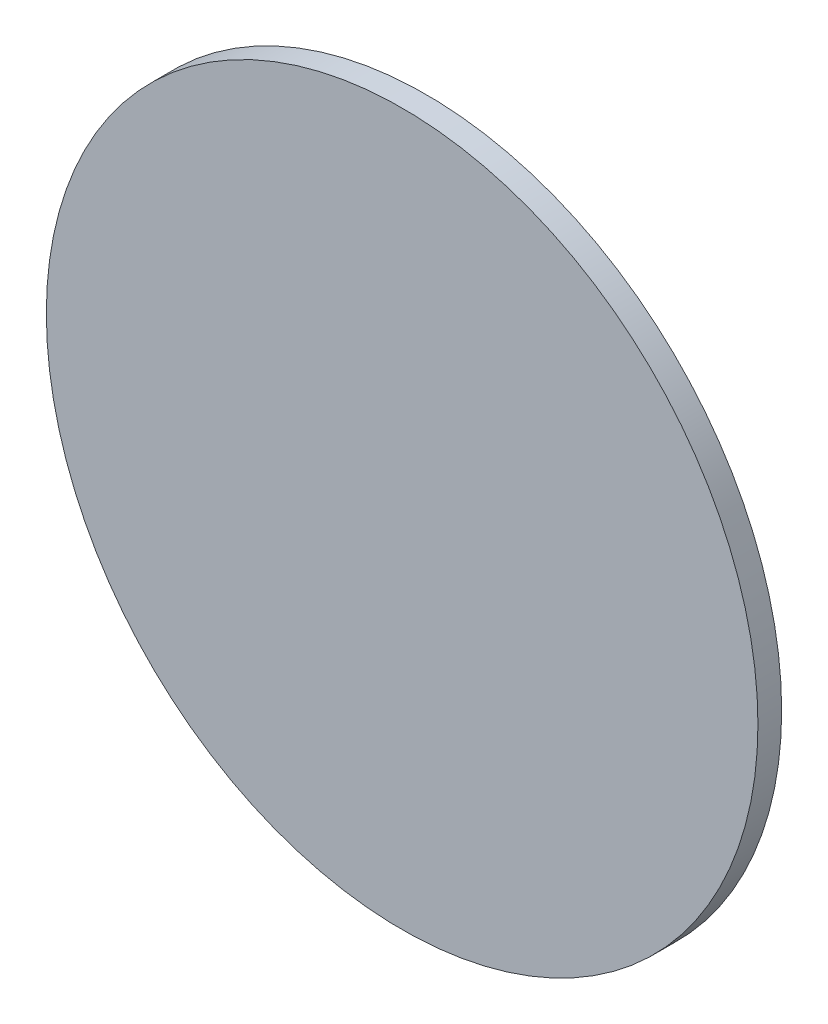
ISO-10303-21;
HEADER;
FILE_DESCRIPTION(('STEP AP214'),'2;1');
FILE_NAME('part.step','',(''),(''),'','','');
FILE_SCHEMA(('AUTOMOTIVE_DESIGN { 1 0 10303 214 1 1 1 1 }'));
ENDSEC;
DATA;
#1=APPLICATION_CONTEXT('core data for automotive mechanical design processes');
#2=APPLICATION_PROTOCOL_DEFINITION('international standard','automotive_design',2000,#1);
#3=PRODUCT_CONTEXT('',#1,'mechanical');
#4=PRODUCT('Part','Part','',(#3));
#5=PRODUCT_RELATED_PRODUCT_CATEGORY('part','',(#4));
#6=PRODUCT_DEFINITION_FORMATION('','',#4);
#7=PRODUCT_DEFINITION_CONTEXT('part definition',#1,'design');
#8=PRODUCT_DEFINITION('design','',#6,#7);
#9=PRODUCT_DEFINITION_SHAPE('','',#8);
#10=(LENGTH_UNIT() NAMED_UNIT(*) SI_UNIT(.MILLI.,.METRE.));
#11=(NAMED_UNIT(*) PLANE_ANGLE_UNIT() SI_UNIT($,.RADIAN.));
#12=(NAMED_UNIT(*) SI_UNIT($,.STERADIAN.) SOLID_ANGLE_UNIT());
#13=UNCERTAINTY_MEASURE_WITH_UNIT(LENGTH_MEASURE(1.E-05),#10,'distance_accuracy_value','');
#14=(GEOMETRIC_REPRESENTATION_CONTEXT(3) GLOBAL_UNCERTAINTY_ASSIGNED_CONTEXT((#13)) GLOBAL_UNIT_ASSIGNED_CONTEXT((#10,
#11,#12)) REPRESENTATION_CONTEXT('',''));
#15=CARTESIAN_POINT('',(0.,0.,0.));
#16=DIRECTION('',(0.,0.,1.));
#17=DIRECTION('',(1.,0.,0.));
#18=AXIS2_PLACEMENT_3D('',#15,#16,#17);
#19=CARTESIAN_POINT('',(0.,0.,10.));
#20=DIRECTION('',(0.,0.,-1.));
#21=DIRECTION('',(-1.,0.,0.));
#22=AXIS2_PLACEMENT_3D('',#19,#20,#21);
#23=CYLINDRICAL_SURFACE('',#22,150.);
#24=CARTESIAN_POINT('',(0.,0.,10.));
#25=DIRECTION('',(0.,0.,1.));
#26=DIRECTION('',(1.,0.,0.));
#27=AXIS2_PLACEMENT_3D('',#24,#25,#26);
#28=CIRCLE('',#27,150.);
#29=CARTESIAN_POINT('',(150.,0.,10.));
#30=VERTEX_POINT('',#29);
#31=EDGE_CURVE('E10',#30,#30,#28,.T.);
#32=ORIENTED_EDGE('',*,*,#31,.F.);
#33=EDGE_LOOP('',(#32));
#34=FACE_BOUND('',#33,.T.);
#35=CARTESIAN_POINT('',(0.,0.,0.));
#36=DIRECTION('',(0.,0.,1.));
#37=DIRECTION('',(1.,0.,0.));
#38=AXIS2_PLACEMENT_3D('',#35,#36,#37);
#39=CIRCLE('',#38,150.);
#40=CARTESIAN_POINT('',(150.,0.,0.));
#41=VERTEX_POINT('',#40);
#42=EDGE_CURVE('E40',#41,#41,#39,.T.);
#43=ORIENTED_EDGE('',*,*,#42,.T.);
#44=EDGE_LOOP('',(#43));
#45=FACE_BOUND('',#44,.T.);
#46=ADVANCED_FACE('F37',(#34,#45),#23,.T.);
#47=CARTESIAN_POINT('',(0.,0.,10.));
#48=DIRECTION('',(0.,0.,1.));
#49=DIRECTION('',(1.,0.,0.));
#50=AXIS2_PLACEMENT_3D('',#47,#48,#49);
#51=PLANE('',#50);
#52=ORIENTED_EDGE('',*,*,#31,.T.);
#53=EDGE_LOOP('',(#52));
#54=FACE_BOUND('',#53,.T.);
#55=ADVANCED_FACE('F54',(#54),#51,.T.);
#56=CARTESIAN_POINT('',(0.,0.,0.));
#57=DIRECTION('',(0.,0.,1.));
#58=DIRECTION('',(1.,0.,0.));
#59=AXIS2_PLACEMENT_3D('',#56,#57,#58);
#60=PLANE('',#59);
#61=ORIENTED_EDGE('',*,*,#42,.F.);
#62=EDGE_LOOP('',(#61));
#63=FACE_BOUND('',#62,.T.);
#64=ADVANCED_FACE('F52',(#63),#60,.F.);
#65=CLOSED_SHELL('',(#46,#55,#64));
#66=MANIFOLD_SOLID_BREP('B2',#65);
#67=ADVANCED_BREP_SHAPE_REPRESENTATION('',(#18,#66),#14);
#68=SHAPE_DEFINITION_REPRESENTATION(#9,#67);
ENDSEC;
END-ISO-10303-21;
